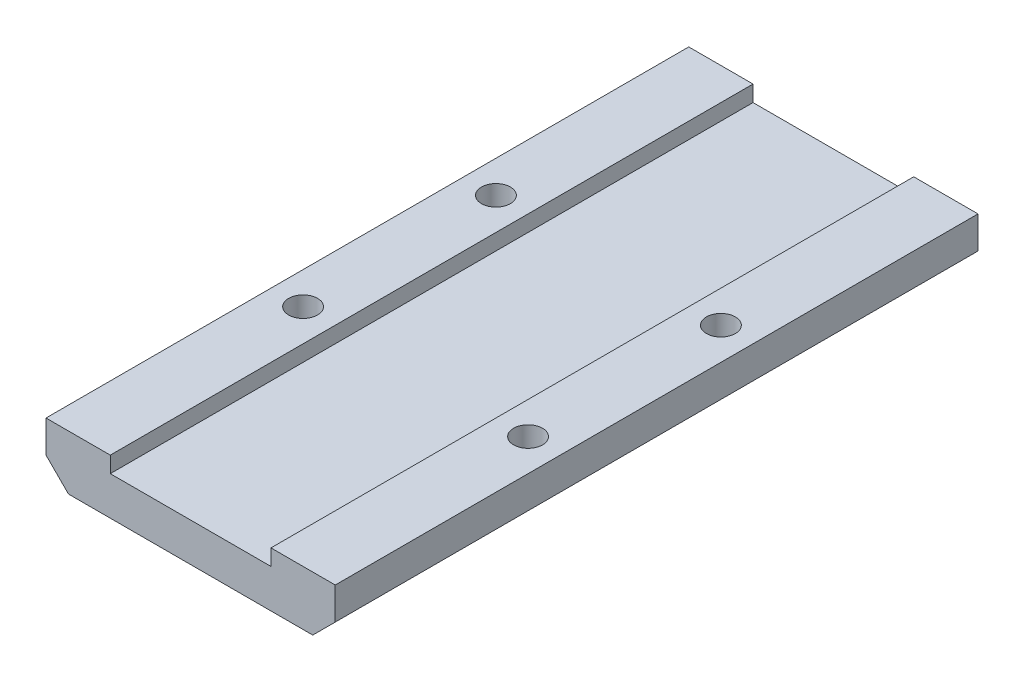
ISO-10303-21;
HEADER;
FILE_DESCRIPTION(('STEP AP214'),'2;1');
FILE_NAME('part.step','',(''),(''),'','','');
FILE_SCHEMA(('AUTOMOTIVE_DESIGN { 1 0 10303 214 1 1 1 1 }'));
ENDSEC;
DATA;
#1=APPLICATION_CONTEXT('core data for automotive mechanical design processes');
#2=APPLICATION_PROTOCOL_DEFINITION('international standard','automotive_design',2000,#1);
#3=PRODUCT_CONTEXT('',#1,'mechanical');
#4=PRODUCT('Part','Part','',(#3));
#5=PRODUCT_RELATED_PRODUCT_CATEGORY('part','',(#4));
#6=PRODUCT_DEFINITION_FORMATION('','',#4);
#7=PRODUCT_DEFINITION_CONTEXT('part definition',#1,'design');
#8=PRODUCT_DEFINITION('design','',#6,#7);
#9=PRODUCT_DEFINITION_SHAPE('','',#8);
#10=(LENGTH_UNIT() NAMED_UNIT(*) SI_UNIT(.MILLI.,.METRE.));
#11=(NAMED_UNIT(*) PLANE_ANGLE_UNIT() SI_UNIT($,.RADIAN.));
#12=(NAMED_UNIT(*) SI_UNIT($,.STERADIAN.) SOLID_ANGLE_UNIT());
#13=UNCERTAINTY_MEASURE_WITH_UNIT(LENGTH_MEASURE(1.E-05),#10,'distance_accuracy_value','');
#14=(GEOMETRIC_REPRESENTATION_CONTEXT(3) GLOBAL_UNCERTAINTY_ASSIGNED_CONTEXT((#13)) GLOBAL_UNIT_ASSIGNED_CONTEXT((#10,
#11,#12)) REPRESENTATION_CONTEXT('',''));
#15=CARTESIAN_POINT('',(0.,0.,0.));
#16=DIRECTION('',(0.,0.,1.));
#17=DIRECTION('',(1.,0.,0.));
#18=AXIS2_PLACEMENT_3D('',#15,#16,#17);
#19=CARTESIAN_POINT('',(-38.,0.,200.));
#20=DIRECTION('',(0.707106781186548,0.707106781186547,0.));
#21=DIRECTION('',(-0.707106781186547,0.707106781186548,0.));
#22=AXIS2_PLACEMENT_3D('',#19,#20,#21);
#23=PLANE('',#22);
#24=DIRECTION('',(0.,0.,-1.));
#25=VECTOR('',#24,1.);
#26=CARTESIAN_POINT('',(-38.,0.,200.));
#27=LINE('',#26,#25);
#28=CARTESIAN_POINT('',(-38.,0.,66.6458980337503));
#29=VERTEX_POINT('',#28);
#30=CARTESIAN_POINT('',(-38.,0.,0.));
#31=VERTEX_POINT('',#30);
#32=EDGE_CURVE('E45',#29,#31,#27,.T.);
#33=ORIENTED_EDGE('',*,*,#32,.F.);
#34=CARTESIAN_POINT('',(-35.,-3.00000000000002,70.));
#35=DIRECTION('',(0.707106781186548,0.707106781186547,0.));
#36=DIRECTION('',(-0.707106781186547,0.707106781186548,0.));
#37=AXIS2_PLACEMENT_3D('',#34,#35,#36);
#38=ELLIPSE('',#37,6.36396103067894,4.50000000000001);
#39=CARTESIAN_POINT('',(-38.,0.,73.3541019662497));
#40=VERTEX_POINT('',#39);
#41=EDGE_CURVE('E51',#40,#29,#38,.F.);
#42=ORIENTED_EDGE('',*,*,#41,.F.);
#43=CARTESIAN_POINT('',(-38.,0.,126.64589803375));
#44=VERTEX_POINT('',#43);
#45=EDGE_CURVE('E44',#44,#40,#27,.T.);
#46=ORIENTED_EDGE('',*,*,#45,.F.);
#47=CARTESIAN_POINT('',(-35.,-3.00000000000002,130.));
#48=DIRECTION('',(0.707106781186548,0.707106781186547,0.));
#49=DIRECTION('',(-0.707106781186547,0.707106781186548,0.));
#50=AXIS2_PLACEMENT_3D('',#47,#48,#49);
#51=ELLIPSE('',#50,6.36396103067894,4.50000000000001);
#52=CARTESIAN_POINT('',(-38.,0.,133.35410196625));
#53=VERTEX_POINT('',#52);
#54=EDGE_CURVE('E212',#53,#44,#51,.F.);
#55=ORIENTED_EDGE('',*,*,#54,.F.);
#56=CARTESIAN_POINT('',(-38.,0.,200.));
#57=VERTEX_POINT('',#56);
#58=EDGE_CURVE('E11',#57,#53,#27,.T.);
#59=ORIENTED_EDGE('',*,*,#58,.F.);
#60=DIRECTION('',(0.707106781186547,-0.707106781186548,0.));
#61=VECTOR('',#60,1.);
#62=CARTESIAN_POINT('',(-38.,0.,200.));
#63=LINE('',#62,#61);
#64=CARTESIAN_POINT('',(-45.,7.,200.));
#65=VERTEX_POINT('',#64);
#66=EDGE_CURVE('E192',#65,#57,#63,.T.);
#67=ORIENTED_EDGE('',*,*,#66,.F.);
#68=DIRECTION('',(0.,0.,-1.));
#69=VECTOR('',#68,1.);
#70=CARTESIAN_POINT('',(-45.,7.,200.));
#71=LINE('',#70,#69);
#72=CARTESIAN_POINT('',(-45.,7.,0.));
#73=VERTEX_POINT('',#72);
#74=EDGE_CURVE('E186',#65,#73,#71,.T.);
#75=ORIENTED_EDGE('',*,*,#74,.T.);
#76=DIRECTION('',(0.707106781186547,-0.707106781186548,0.));
#77=VECTOR('',#76,1.);
#78=CARTESIAN_POINT('',(-38.,0.,0.));
#79=LINE('',#78,#77);
#80=EDGE_CURVE('E209',#73,#31,#79,.T.);
#81=ORIENTED_EDGE('',*,*,#80,.T.);
#82=EDGE_LOOP('',(#33,#42,#46,#55,#59,#67,#75,#81));
#83=FACE_BOUND('',#82,.T.);
#84=ADVANCED_FACE('F37',(#83),#23,.F.);
#85=CARTESIAN_POINT('',(38.,0.,200.));
#86=DIRECTION('',(0.,1.,0.));
#87=DIRECTION('',(0.,0.,1.));
#88=AXIS2_PLACEMENT_3D('',#85,#86,#87);
#89=PLANE('',#88);
#90=DIRECTION('',(0.,0.,-1.));
#91=VECTOR('',#90,1.);
#92=CARTESIAN_POINT('',(38.,0.,200.));
#93=LINE('',#92,#91);
#94=CARTESIAN_POINT('',(38.,0.,126.64589803375));
#95=VERTEX_POINT('',#94);
#96=CARTESIAN_POINT('',(38.,0.,73.3541019662497));
#97=VERTEX_POINT('',#96);
#98=EDGE_CURVE('E152',#95,#97,#93,.T.);
#99=ORIENTED_EDGE('',*,*,#98,.F.);
#100=CARTESIAN_POINT('',(35.,0.,130.));
#101=DIRECTION('',(0.,1.,0.));
#102=DIRECTION('',(0.,0.,1.));
#103=AXIS2_PLACEMENT_3D('',#100,#101,#102);
#104=CIRCLE('',#103,4.50000000000001);
#105=CARTESIAN_POINT('',(38.,0.,133.35410196625));
#106=VERTEX_POINT('',#105);
#107=EDGE_CURVE('E140',#106,#95,#104,.F.);
#108=ORIENTED_EDGE('',*,*,#107,.F.);
#109=CARTESIAN_POINT('',(38.,0.,200.));
#110=VERTEX_POINT('',#109);
#111=EDGE_CURVE('E150',#110,#106,#93,.T.);
#112=ORIENTED_EDGE('',*,*,#111,.F.);
#113=DIRECTION('',(1.,0.,0.));
#114=VECTOR('',#113,1.);
#115=CARTESIAN_POINT('',(38.,0.,200.));
#116=LINE('',#115,#114);
#117=EDGE_CURVE('E227',#57,#110,#116,.T.);
#118=ORIENTED_EDGE('',*,*,#117,.F.);
#119=ORIENTED_EDGE('',*,*,#58,.T.);
#120=CARTESIAN_POINT('',(-35.,0.,130.));
#121=DIRECTION('',(0.,1.,0.));
#122=DIRECTION('',(0.,0.,1.));
#123=AXIS2_PLACEMENT_3D('',#120,#121,#122);
#124=CIRCLE('',#123,4.50000000000001);
#125=EDGE_CURVE('E232',#44,#53,#124,.F.);
#126=ORIENTED_EDGE('',*,*,#125,.F.);
#127=ORIENTED_EDGE('',*,*,#45,.T.);
#128=CARTESIAN_POINT('',(-35.,0.,70.));
#129=DIRECTION('',(0.,1.,0.));
#130=DIRECTION('',(0.,0.,1.));
#131=AXIS2_PLACEMENT_3D('',#128,#129,#130);
#132=CIRCLE('',#131,4.50000000000001);
#133=EDGE_CURVE('E244',#29,#40,#132,.F.);
#134=ORIENTED_EDGE('',*,*,#133,.F.);
#135=ORIENTED_EDGE('',*,*,#32,.T.);
#136=DIRECTION('',(1.,0.,0.));
#137=VECTOR('',#136,1.);
#138=CARTESIAN_POINT('',(38.,0.,0.));
#139=LINE('',#138,#137);
#140=CARTESIAN_POINT('',(38.,0.,0.));
#141=VERTEX_POINT('',#140);
#142=EDGE_CURVE('E207',#31,#141,#139,.T.);
#143=ORIENTED_EDGE('',*,*,#142,.T.);
#144=CARTESIAN_POINT('',(38.,0.,66.6458980337503));
#145=VERTEX_POINT('',#144);
#146=EDGE_CURVE('E158',#145,#141,#93,.T.);
#147=ORIENTED_EDGE('',*,*,#146,.F.);
#148=CARTESIAN_POINT('',(35.,0.,70.));
#149=DIRECTION('',(0.,1.,0.));
#150=DIRECTION('',(0.,0.,1.));
#151=AXIS2_PLACEMENT_3D('',#148,#149,#150);
#152=CIRCLE('',#151,4.50000000000001);
#153=EDGE_CURVE('E58',#97,#145,#152,.F.);
#154=ORIENTED_EDGE('',*,*,#153,.F.);
#155=EDGE_LOOP('',(#99,#108,#112,#118,#119,#126,#127,#134,#135,#143,#147,#154));
#156=FACE_BOUND('',#155,.T.);
#157=ADVANCED_FACE('F149',(#156),#89,.F.);
#158=CARTESIAN_POINT('',(38.,0.,200.));
#159=DIRECTION('',(-0.707106781186548,0.707106781186547,0.));
#160=DIRECTION('',(-0.707106781186547,-0.707106781186548,0.));
#161=AXIS2_PLACEMENT_3D('',#158,#159,#160);
#162=PLANE('',#161);
#163=ORIENTED_EDGE('',*,*,#111,.T.);
#164=CARTESIAN_POINT('',(35.,-2.99999999999999,130.));
#165=DIRECTION('',(-0.707106781186548,0.707106781186547,0.));
#166=DIRECTION('',(0.707106781186547,0.707106781186548,0.));
#167=AXIS2_PLACEMENT_3D('',#164,#165,#166);
#168=ELLIPSE('',#167,6.36396103067894,4.50000000000001);
#169=EDGE_CURVE('E137',#95,#106,#168,.F.);
#170=ORIENTED_EDGE('',*,*,#169,.F.);
#171=ORIENTED_EDGE('',*,*,#98,.T.);
#172=CARTESIAN_POINT('',(35.,-2.99999999999999,70.));
#173=DIRECTION('',(-0.707106781186548,0.707106781186547,0.));
#174=DIRECTION('',(0.707106781186547,0.707106781186548,0.));
#175=AXIS2_PLACEMENT_3D('',#172,#173,#174);
#176=ELLIPSE('',#175,6.36396103067894,4.50000000000001);
#177=EDGE_CURVE('E238',#145,#97,#176,.F.);
#178=ORIENTED_EDGE('',*,*,#177,.F.);
#179=ORIENTED_EDGE('',*,*,#146,.T.);
#180=DIRECTION('',(0.707106781186547,0.707106781186548,0.));
#181=VECTOR('',#180,1.);
#182=CARTESIAN_POINT('',(38.,0.,0.));
#183=LINE('',#182,#181);
#184=CARTESIAN_POINT('',(45.,7.,0.));
#185=VERTEX_POINT('',#184);
#186=EDGE_CURVE('E205',#141,#185,#183,.T.);
#187=ORIENTED_EDGE('',*,*,#186,.T.);
#188=DIRECTION('',(0.,0.,-1.));
#189=VECTOR('',#188,1.);
#190=CARTESIAN_POINT('',(45.,7.,200.));
#191=LINE('',#190,#189);
#192=CARTESIAN_POINT('',(45.,7.,200.));
#193=VERTEX_POINT('',#192);
#194=EDGE_CURVE('E160',#193,#185,#191,.T.);
#195=ORIENTED_EDGE('',*,*,#194,.F.);
#196=DIRECTION('',(0.707106781186547,0.707106781186548,0.));
#197=VECTOR('',#196,1.);
#198=CARTESIAN_POINT('',(38.,0.,200.));
#199=LINE('',#198,#197);
#200=EDGE_CURVE('E157',#110,#193,#199,.T.);
#201=ORIENTED_EDGE('',*,*,#200,.F.);
#202=EDGE_LOOP('',(#163,#170,#171,#178,#179,#187,#195,#201));
#203=FACE_BOUND('',#202,.T.);
#204=ADVANCED_FACE('F155',(#203),#162,.F.);
#205=CARTESIAN_POINT('',(45.,7.,200.));
#206=DIRECTION('',(-1.,0.,0.));
#207=DIRECTION('',(0.,0.,1.));
#208=AXIS2_PLACEMENT_3D('',#205,#206,#207);
#209=PLANE('',#208);
#210=DIRECTION('',(0.,1.,0.));
#211=VECTOR('',#210,1.);
#212=CARTESIAN_POINT('',(45.,7.,0.));
#213=LINE('',#212,#211);
#214=CARTESIAN_POINT('',(45.,17.,0.));
#215=VERTEX_POINT('',#214);
#216=EDGE_CURVE('E203',#185,#215,#213,.T.);
#217=ORIENTED_EDGE('',*,*,#216,.T.);
#218=DIRECTION('',(0.,0.,-1.));
#219=VECTOR('',#218,1.);
#220=CARTESIAN_POINT('',(45.,17.,200.));
#221=LINE('',#220,#219);
#222=CARTESIAN_POINT('',(45.,17.,200.));
#223=VERTEX_POINT('',#222);
#224=EDGE_CURVE('E164',#223,#215,#221,.T.);
#225=ORIENTED_EDGE('',*,*,#224,.F.);
#226=DIRECTION('',(0.,1.,0.));
#227=VECTOR('',#226,1.);
#228=CARTESIAN_POINT('',(45.,7.,200.));
#229=LINE('',#228,#227);
#230=EDGE_CURVE('E224',#193,#223,#229,.T.);
#231=ORIENTED_EDGE('',*,*,#230,.F.);
#232=ORIENTED_EDGE('',*,*,#194,.T.);
#233=EDGE_LOOP('',(#217,#225,#231,#232));
#234=FACE_BOUND('',#233,.T.);
#235=ADVANCED_FACE('F256',(#234),#209,.F.);
#236=CARTESIAN_POINT('',(45.,17.,200.));
#237=DIRECTION('',(0.,-1.,0.));
#238=DIRECTION('',(0.,0.,-1.));
#239=AXIS2_PLACEMENT_3D('',#236,#237,#238);
#240=PLANE('',#239);
#241=CARTESIAN_POINT('',(35.,17.,130.));
#242=DIRECTION('',(0.,1.,0.));
#243=DIRECTION('',(0.,0.,1.));
#244=AXIS2_PLACEMENT_3D('',#241,#242,#243);
#245=CIRCLE('',#244,4.50000000000001);
#246=CARTESIAN_POINT('',(35.,17.,134.5));
#247=VERTEX_POINT('',#246);
#248=EDGE_CURVE('E145',#247,#247,#245,.T.);
#249=ORIENTED_EDGE('',*,*,#248,.F.);
#250=EDGE_LOOP('',(#249));
#251=FACE_BOUND('',#250,.T.);
#252=CARTESIAN_POINT('',(35.,17.,70.));
#253=DIRECTION('',(0.,1.,0.));
#254=DIRECTION('',(0.,0.,1.));
#255=AXIS2_PLACEMENT_3D('',#252,#253,#254);
#256=CIRCLE('',#255,4.50000000000001);
#257=CARTESIAN_POINT('',(35.,17.,74.5));
#258=VERTEX_POINT('',#257);
#259=EDGE_CURVE('E240',#258,#258,#256,.T.);
#260=ORIENTED_EDGE('',*,*,#259,.F.);
#261=EDGE_LOOP('',(#260));
#262=FACE_BOUND('',#261,.T.);
#263=DIRECTION('',(-1.,0.,0.));
#264=VECTOR('',#263,1.);
#265=CARTESIAN_POINT('',(45.,17.,0.));
#266=LINE('',#265,#264);
#267=CARTESIAN_POINT('',(25.,17.,0.));
#268=VERTEX_POINT('',#267);
#269=EDGE_CURVE('E201',#215,#268,#266,.T.);
#270=ORIENTED_EDGE('',*,*,#269,.T.);
#271=DIRECTION('',(0.,0.,-1.));
#272=VECTOR('',#271,1.);
#273=CARTESIAN_POINT('',(25.,17.,200.));
#274=LINE('',#273,#272);
#275=CARTESIAN_POINT('',(25.,17.,200.));
#276=VERTEX_POINT('',#275);
#277=EDGE_CURVE('E169',#276,#268,#274,.T.);
#278=ORIENTED_EDGE('',*,*,#277,.F.);
#279=DIRECTION('',(-1.,0.,0.));
#280=VECTOR('',#279,1.);
#281=CARTESIAN_POINT('',(45.,17.,200.));
#282=LINE('',#281,#280);
#283=EDGE_CURVE('E222',#223,#276,#282,.T.);
#284=ORIENTED_EDGE('',*,*,#283,.F.);
#285=ORIENTED_EDGE('',*,*,#224,.T.);
#286=EDGE_LOOP('',(#270,#278,#284,#285));
#287=FACE_BOUND('',#286,.T.);
#288=ADVANCED_FACE('F252',(#251,#262,#287),#240,.F.);
#289=CARTESIAN_POINT('',(25.,17.,200.));
#290=DIRECTION('',(1.,0.,0.));
#291=DIRECTION('',(0.,0.,-1.));
#292=AXIS2_PLACEMENT_3D('',#289,#290,#291);
#293=PLANE('',#292);
#294=DIRECTION('',(0.,-1.,0.));
#295=VECTOR('',#294,1.);
#296=CARTESIAN_POINT('',(25.,17.,0.));
#297=LINE('',#296,#295);
#298=CARTESIAN_POINT('',(25.,12.,0.));
#299=VERTEX_POINT('',#298);
#300=EDGE_CURVE('E199',#268,#299,#297,.T.);
#301=ORIENTED_EDGE('',*,*,#300,.T.);
#302=DIRECTION('',(0.,0.,-1.));
#303=VECTOR('',#302,1.);
#304=CARTESIAN_POINT('',(25.,12.,200.));
#305=LINE('',#304,#303);
#306=CARTESIAN_POINT('',(25.,12.,200.));
#307=VERTEX_POINT('',#306);
#308=EDGE_CURVE('E174',#307,#299,#305,.T.);
#309=ORIENTED_EDGE('',*,*,#308,.F.);
#310=DIRECTION('',(0.,-1.,0.));
#311=VECTOR('',#310,1.);
#312=CARTESIAN_POINT('',(25.,17.,200.));
#313=LINE('',#312,#311);
#314=EDGE_CURVE('E220',#276,#307,#313,.T.);
#315=ORIENTED_EDGE('',*,*,#314,.F.);
#316=ORIENTED_EDGE('',*,*,#277,.T.);
#317=EDGE_LOOP('',(#301,#309,#315,#316));
#318=FACE_BOUND('',#317,.T.);
#319=ADVANCED_FACE('F255',(#318),#293,.F.);
#320=CARTESIAN_POINT('',(-25.,12.,200.));
#321=DIRECTION('',(0.,-1.,0.));
#322=DIRECTION('',(0.,0.,-1.));
#323=AXIS2_PLACEMENT_3D('',#320,#321,#322);
#324=PLANE('',#323);
#325=DIRECTION('',(-1.,0.,0.));
#326=VECTOR('',#325,1.);
#327=CARTESIAN_POINT('',(-25.,12.,0.));
#328=LINE('',#327,#326);
#329=CARTESIAN_POINT('',(-25.,12.,0.));
#330=VERTEX_POINT('',#329);
#331=EDGE_CURVE('E197',#299,#330,#328,.T.);
#332=ORIENTED_EDGE('',*,*,#331,.T.);
#333=DIRECTION('',(0.,0.,-1.));
#334=VECTOR('',#333,1.);
#335=CARTESIAN_POINT('',(-25.,12.,200.));
#336=LINE('',#335,#334);
#337=CARTESIAN_POINT('',(-25.,12.,200.));
#338=VERTEX_POINT('',#337);
#339=EDGE_CURVE('E177',#338,#330,#336,.T.);
#340=ORIENTED_EDGE('',*,*,#339,.F.);
#341=DIRECTION('',(-1.,0.,0.));
#342=VECTOR('',#341,1.);
#343=CARTESIAN_POINT('',(-25.,12.,200.));
#344=LINE('',#343,#342);
#345=EDGE_CURVE('E218',#307,#338,#344,.T.);
#346=ORIENTED_EDGE('',*,*,#345,.F.);
#347=ORIENTED_EDGE('',*,*,#308,.T.);
#348=EDGE_LOOP('',(#332,#340,#346,#347));
#349=FACE_BOUND('',#348,.T.);
#350=ADVANCED_FACE('F276',(#349),#324,.F.);
#351=CARTESIAN_POINT('',(-25.,17.,200.));
#352=DIRECTION('',(-1.,0.,0.));
#353=DIRECTION('',(0.,0.,1.));
#354=AXIS2_PLACEMENT_3D('',#351,#352,#353);
#355=PLANE('',#354);
#356=DIRECTION('',(0.,1.,0.));
#357=VECTOR('',#356,1.);
#358=CARTESIAN_POINT('',(-25.,17.,0.));
#359=LINE('',#358,#357);
#360=CARTESIAN_POINT('',(-25.,17.,0.));
#361=VERTEX_POINT('',#360);
#362=EDGE_CURVE('E195',#330,#361,#359,.T.);
#363=ORIENTED_EDGE('',*,*,#362,.T.);
#364=DIRECTION('',(0.,0.,-1.));
#365=VECTOR('',#364,1.);
#366=CARTESIAN_POINT('',(-25.,17.,200.));
#367=LINE('',#366,#365);
#368=CARTESIAN_POINT('',(-25.,17.,200.));
#369=VERTEX_POINT('',#368);
#370=EDGE_CURVE('E180',#369,#361,#367,.T.);
#371=ORIENTED_EDGE('',*,*,#370,.F.);
#372=DIRECTION('',(0.,1.,0.));
#373=VECTOR('',#372,1.);
#374=CARTESIAN_POINT('',(-25.,17.,200.));
#375=LINE('',#374,#373);
#376=EDGE_CURVE('E216',#338,#369,#375,.T.);
#377=ORIENTED_EDGE('',*,*,#376,.F.);
#378=ORIENTED_EDGE('',*,*,#339,.T.);
#379=EDGE_LOOP('',(#363,#371,#377,#378));
#380=FACE_BOUND('',#379,.T.);
#381=ADVANCED_FACE('F280',(#380),#355,.F.);
#382=CARTESIAN_POINT('',(-45.,17.,200.));
#383=DIRECTION('',(0.,-1.,0.));
#384=DIRECTION('',(0.,0.,-1.));
#385=AXIS2_PLACEMENT_3D('',#382,#383,#384);
#386=PLANE('',#385);
#387=CARTESIAN_POINT('',(-35.,17.,70.));
#388=DIRECTION('',(0.,1.,0.));
#389=DIRECTION('',(0.,0.,1.));
#390=AXIS2_PLACEMENT_3D('',#387,#388,#389);
#391=CIRCLE('',#390,4.50000000000001);
#392=CARTESIAN_POINT('',(-35.,17.,74.5));
#393=VERTEX_POINT('',#392);
#394=EDGE_CURVE('E237',#393,#393,#391,.T.);
#395=ORIENTED_EDGE('',*,*,#394,.F.);
#396=EDGE_LOOP('',(#395));
#397=FACE_BOUND('',#396,.T.);
#398=CARTESIAN_POINT('',(-35.,17.,130.));
#399=DIRECTION('',(0.,1.,0.));
#400=DIRECTION('',(0.,0.,1.));
#401=AXIS2_PLACEMENT_3D('',#398,#399,#400);
#402=CIRCLE('',#401,4.50000000000001);
#403=CARTESIAN_POINT('',(-35.,17.,134.5));
#404=VERTEX_POINT('',#403);
#405=EDGE_CURVE('E153',#404,#404,#402,.T.);
#406=ORIENTED_EDGE('',*,*,#405,.F.);
#407=EDGE_LOOP('',(#406));
#408=FACE_BOUND('',#407,.T.);
#409=DIRECTION('',(-1.,0.,0.));
#410=VECTOR('',#409,1.);
#411=CARTESIAN_POINT('',(-45.,17.,0.));
#412=LINE('',#411,#410);
#413=CARTESIAN_POINT('',(-45.,17.,0.));
#414=VERTEX_POINT('',#413);
#415=EDGE_CURVE('E193',#361,#414,#412,.T.);
#416=ORIENTED_EDGE('',*,*,#415,.T.);
#417=DIRECTION('',(0.,0.,-1.));
#418=VECTOR('',#417,1.);
#419=CARTESIAN_POINT('',(-45.,17.,200.));
#420=LINE('',#419,#418);
#421=CARTESIAN_POINT('',(-45.,17.,200.));
#422=VERTEX_POINT('',#421);
#423=EDGE_CURVE('E183',#422,#414,#420,.T.);
#424=ORIENTED_EDGE('',*,*,#423,.F.);
#425=DIRECTION('',(-1.,0.,0.));
#426=VECTOR('',#425,1.);
#427=CARTESIAN_POINT('',(-45.,17.,200.));
#428=LINE('',#427,#426);
#429=EDGE_CURVE('E214',#369,#422,#428,.T.);
#430=ORIENTED_EDGE('',*,*,#429,.F.);
#431=ORIENTED_EDGE('',*,*,#370,.T.);
#432=EDGE_LOOP('',(#416,#424,#430,#431));
#433=FACE_BOUND('',#432,.T.);
#434=ADVANCED_FACE('F298',(#397,#408,#433),#386,.F.);
#435=CARTESIAN_POINT('',(-45.,7.,200.));
#436=DIRECTION('',(1.,0.,0.));
#437=DIRECTION('',(0.,0.,-1.));
#438=AXIS2_PLACEMENT_3D('',#435,#436,#437);
#439=PLANE('',#438);
#440=DIRECTION('',(0.,-1.,0.));
#441=VECTOR('',#440,1.);
#442=CARTESIAN_POINT('',(-45.,7.,0.));
#443=LINE('',#442,#441);
#444=EDGE_CURVE('E190',#414,#73,#443,.T.);
#445=ORIENTED_EDGE('',*,*,#444,.T.);
#446=ORIENTED_EDGE('',*,*,#74,.F.);
#447=DIRECTION('',(0.,-1.,0.));
#448=VECTOR('',#447,1.);
#449=CARTESIAN_POINT('',(-45.,7.,200.));
#450=LINE('',#449,#448);
#451=EDGE_CURVE('E189',#422,#65,#450,.T.);
#452=ORIENTED_EDGE('',*,*,#451,.F.);
#453=ORIENTED_EDGE('',*,*,#423,.T.);
#454=EDGE_LOOP('',(#445,#446,#452,#453));
#455=FACE_BOUND('',#454,.T.);
#456=ADVANCED_FACE('F296',(#455),#439,.F.);
#457=CARTESIAN_POINT('',(0.,0.,200.));
#458=DIRECTION('',(0.,0.,-1.));
#459=DIRECTION('',(-1.,0.,0.));
#460=AXIS2_PLACEMENT_3D('',#457,#458,#459);
#461=PLANE('',#460);
#462=ORIENTED_EDGE('',*,*,#66,.T.);
#463=ORIENTED_EDGE('',*,*,#117,.T.);
#464=ORIENTED_EDGE('',*,*,#200,.T.);
#465=ORIENTED_EDGE('',*,*,#230,.T.);
#466=ORIENTED_EDGE('',*,*,#283,.T.);
#467=ORIENTED_EDGE('',*,*,#314,.T.);
#468=ORIENTED_EDGE('',*,*,#345,.T.);
#469=ORIENTED_EDGE('',*,*,#376,.T.);
#470=ORIENTED_EDGE('',*,*,#429,.T.);
#471=ORIENTED_EDGE('',*,*,#451,.T.);
#472=EDGE_LOOP('',(#462,#463,#464,#465,#466,#467,#468,#469,#470,#471));
#473=FACE_BOUND('',#472,.T.);
#474=ADVANCED_FACE('F284',(#473),#461,.F.);
#475=CARTESIAN_POINT('',(0.,0.,0.));
#476=DIRECTION('',(0.,0.,-1.));
#477=DIRECTION('',(-1.,0.,0.));
#478=AXIS2_PLACEMENT_3D('',#475,#476,#477);
#479=PLANE('',#478);
#480=ORIENTED_EDGE('',*,*,#80,.F.);
#481=ORIENTED_EDGE('',*,*,#444,.F.);
#482=ORIENTED_EDGE('',*,*,#415,.F.);
#483=ORIENTED_EDGE('',*,*,#362,.F.);
#484=ORIENTED_EDGE('',*,*,#331,.F.);
#485=ORIENTED_EDGE('',*,*,#300,.F.);
#486=ORIENTED_EDGE('',*,*,#269,.F.);
#487=ORIENTED_EDGE('',*,*,#216,.F.);
#488=ORIENTED_EDGE('',*,*,#186,.F.);
#489=ORIENTED_EDGE('',*,*,#142,.F.);
#490=EDGE_LOOP('',(#480,#481,#482,#483,#484,#485,#486,#487,#488,#489));
#491=FACE_BOUND('',#490,.T.);
#492=ADVANCED_FACE('F271',(#491),#479,.T.);
#493=CARTESIAN_POINT('',(-35.,-0.00100000000000447,130.));
#494=DIRECTION('',(0.,1.,0.));
#495=DIRECTION('',(0.,0.,1.));
#496=AXIS2_PLACEMENT_3D('',#493,#494,#495);
#497=CYLINDRICAL_SURFACE('',#496,4.50000000000001);
#498=ORIENTED_EDGE('',*,*,#405,.T.);
#499=EDGE_LOOP('',(#498));
#500=FACE_BOUND('',#499,.T.);
#501=ORIENTED_EDGE('',*,*,#54,.T.);
#502=ORIENTED_EDGE('',*,*,#125,.T.);
#503=EDGE_LOOP('',(#501,#502));
#504=FACE_BOUND('',#503,.T.);
#505=ADVANCED_FACE('F356',(#500,#504),#497,.F.);
#506=CARTESIAN_POINT('',(-35.,-0.00100000000000447,70.));
#507=DIRECTION('',(0.,1.,0.));
#508=DIRECTION('',(0.,0.,1.));
#509=AXIS2_PLACEMENT_3D('',#506,#507,#508);
#510=CYLINDRICAL_SURFACE('',#509,4.50000000000001);
#511=ORIENTED_EDGE('',*,*,#394,.T.);
#512=EDGE_LOOP('',(#511));
#513=FACE_BOUND('',#512,.T.);
#514=ORIENTED_EDGE('',*,*,#41,.T.);
#515=ORIENTED_EDGE('',*,*,#133,.T.);
#516=EDGE_LOOP('',(#514,#515));
#517=FACE_BOUND('',#516,.T.);
#518=ADVANCED_FACE('F364',(#513,#517),#510,.F.);
#519=CARTESIAN_POINT('',(35.,-0.00100000000000447,70.));
#520=DIRECTION('',(0.,1.,0.));
#521=DIRECTION('',(0.,0.,1.));
#522=AXIS2_PLACEMENT_3D('',#519,#520,#521);
#523=CYLINDRICAL_SURFACE('',#522,4.50000000000001);
#524=ORIENTED_EDGE('',*,*,#259,.T.);
#525=EDGE_LOOP('',(#524));
#526=FACE_BOUND('',#525,.T.);
#527=ORIENTED_EDGE('',*,*,#153,.T.);
#528=ORIENTED_EDGE('',*,*,#177,.T.);
#529=EDGE_LOOP('',(#527,#528));
#530=FACE_BOUND('',#529,.T.);
#531=ADVANCED_FACE('F399',(#526,#530),#523,.F.);
#532=CARTESIAN_POINT('',(35.,-0.00100000000000447,130.));
#533=DIRECTION('',(0.,1.,0.));
#534=DIRECTION('',(0.,0.,1.));
#535=AXIS2_PLACEMENT_3D('',#532,#533,#534);
#536=CYLINDRICAL_SURFACE('',#535,4.50000000000001);
#537=ORIENTED_EDGE('',*,*,#248,.T.);
#538=EDGE_LOOP('',(#537));
#539=FACE_BOUND('',#538,.T.);
#540=ORIENTED_EDGE('',*,*,#107,.T.);
#541=ORIENTED_EDGE('',*,*,#169,.T.);
#542=EDGE_LOOP('',(#540,#541));
#543=FACE_BOUND('',#542,.T.);
#544=ADVANCED_FACE('F139',(#539,#543),#536,.F.);
#545=CLOSED_SHELL('',(#84,#157,#204,#235,#288,#319,#350,#381,#434,#456,#474,#492,#505,#518,#531,#544));
#546=MANIFOLD_SOLID_BREP('B2',#545);
#547=ADVANCED_BREP_SHAPE_REPRESENTATION('',(#18,#546),#14);
#548=SHAPE_DEFINITION_REPRESENTATION(#9,#547);
ENDSEC;
END-ISO-10303-21;
